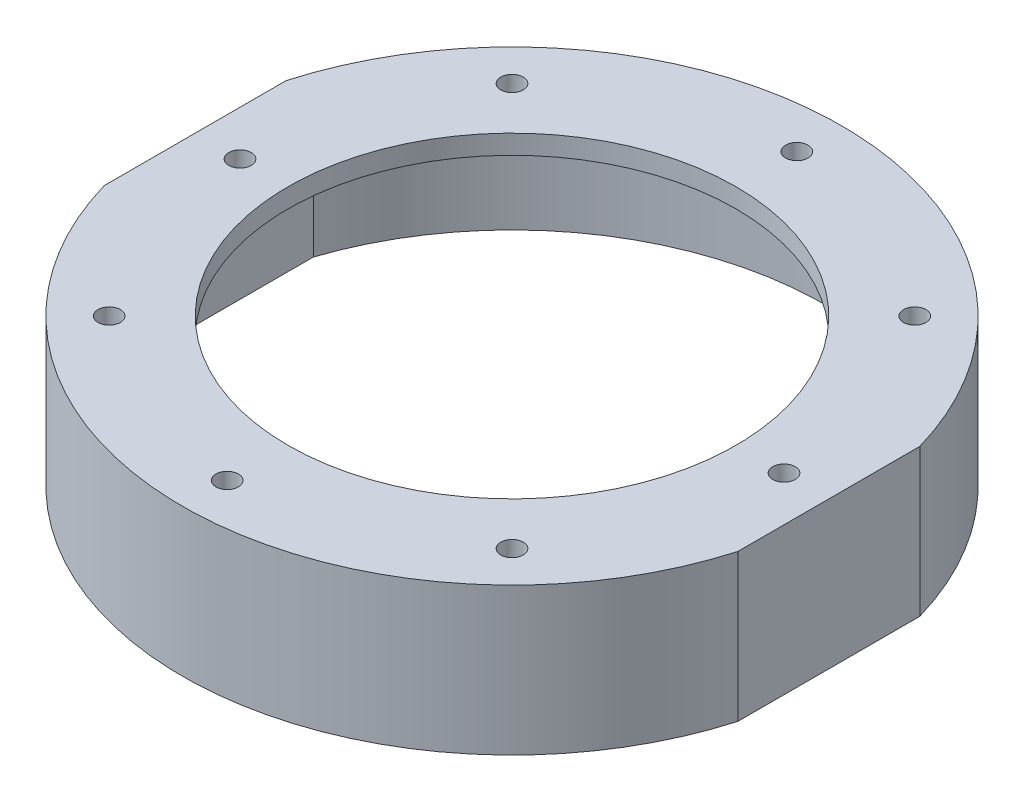
ISO-10303-21;
HEADER;
FILE_DESCRIPTION(('STEP AP214'),'2;1');
FILE_NAME('part.step','',(''),(''),'','','');
FILE_SCHEMA(('AUTOMOTIVE_DESIGN { 1 0 10303 214 1 1 1 1 }'));
ENDSEC;
DATA;
#1=APPLICATION_CONTEXT('core data for automotive mechanical design processes');
#2=APPLICATION_PROTOCOL_DEFINITION('international standard','automotive_design',2000,#1);
#3=PRODUCT_CONTEXT('',#1,'mechanical');
#4=PRODUCT('Part','Part','',(#3));
#5=PRODUCT_RELATED_PRODUCT_CATEGORY('part','',(#4));
#6=PRODUCT_DEFINITION_FORMATION('','',#4);
#7=PRODUCT_DEFINITION_CONTEXT('part definition',#1,'design');
#8=PRODUCT_DEFINITION('design','',#6,#7);
#9=PRODUCT_DEFINITION_SHAPE('','',#8);
#10=(LENGTH_UNIT() NAMED_UNIT(*) SI_UNIT(.MILLI.,.METRE.));
#11=(NAMED_UNIT(*) PLANE_ANGLE_UNIT() SI_UNIT($,.RADIAN.));
#12=(NAMED_UNIT(*) SI_UNIT($,.STERADIAN.) SOLID_ANGLE_UNIT());
#13=UNCERTAINTY_MEASURE_WITH_UNIT(LENGTH_MEASURE(1.E-05),#10,'distance_accuracy_value','');
#14=(GEOMETRIC_REPRESENTATION_CONTEXT(3) GLOBAL_UNCERTAINTY_ASSIGNED_CONTEXT((#13)) GLOBAL_UNIT_ASSIGNED_CONTEXT((#10,
#11,#12)) REPRESENTATION_CONTEXT('',''));
#15=CARTESIAN_POINT('',(0.,0.,0.));
#16=DIRECTION('',(0.,0.,1.));
#17=DIRECTION('',(1.,0.,0.));
#18=AXIS2_PLACEMENT_3D('',#15,#16,#17);
#19=CARTESIAN_POINT('',(0.,0.,0.));
#20=DIRECTION('',(0.,1.,0.));
#21=DIRECTION('',(0.,0.,1.));
#22=AXIS2_PLACEMENT_3D('',#19,#20,#21);
#23=PLANE('',#22);
#24=CARTESIAN_POINT('',(0.,0.,0.));
#25=DIRECTION('',(0.,1.,0.));
#26=DIRECTION('',(0.,0.,1.));
#27=AXIS2_PLACEMENT_3D('',#24,#25,#26);
#28=CIRCLE('',#27,49.);
#29=CARTESIAN_POINT('',(46.5,0.,-15.4515371403624));
#30=VERTEX_POINT('',#29);
#31=CARTESIAN_POINT('',(-46.5,0.,-15.4515371403625));
#32=VERTEX_POINT('',#31);
#33=EDGE_CURVE('E176',#30,#32,#28,.T.);
#34=ORIENTED_EDGE('',*,*,#33,.T.);
#35=DIRECTION('',(0.,0.,-1.));
#36=VECTOR('',#35,1.);
#37=CARTESIAN_POINT('',(-46.5,0.,0.));
#38=LINE('',#37,#36);
#39=CARTESIAN_POINT('',(-46.5,0.,15.4515371403625));
#40=VERTEX_POINT('',#39);
#41=EDGE_CURVE('E163',#40,#32,#38,.T.);
#42=ORIENTED_EDGE('',*,*,#41,.F.);
#43=CARTESIAN_POINT('',(0.,0.,0.));
#44=DIRECTION('',(0.,1.,0.));
#45=DIRECTION('',(0.,0.,1.));
#46=AXIS2_PLACEMENT_3D('',#43,#44,#45);
#47=CIRCLE('',#46,49.);
#48=CARTESIAN_POINT('',(46.5,0.,15.4515371403624));
#49=VERTEX_POINT('',#48);
#50=EDGE_CURVE('E184',#40,#49,#47,.T.);
#51=ORIENTED_EDGE('',*,*,#50,.T.);
#52=DIRECTION('',(0.,0.,-1.));
#53=VECTOR('',#52,1.);
#54=CARTESIAN_POINT('',(46.5,0.,0.));
#55=LINE('',#54,#53);
#56=EDGE_CURVE('E180',#49,#30,#55,.T.);
#57=ORIENTED_EDGE('',*,*,#56,.T.);
#58=EDGE_LOOP('',(#34,#42,#51,#57));
#59=FACE_BOUND('',#58,.T.);
#60=CARTESIAN_POINT('',(0.,0.,0.));
#61=DIRECTION('',(0.,1.,0.));
#62=DIRECTION('',(0.,0.,1.));
#63=AXIS2_PLACEMENT_3D('',#60,#61,#62);
#64=CIRCLE('',#63,51.5);
#65=CARTESIAN_POINT('',(49.5,0.,-14.2126704035518));
#66=VERTEX_POINT('',#65);
#67=CARTESIAN_POINT('',(-49.5,0.,-14.2126704035519));
#68=VERTEX_POINT('',#67);
#69=EDGE_CURVE('E127',#66,#68,#64,.T.);
#70=ORIENTED_EDGE('',*,*,#69,.F.);
#71=DIRECTION('',(0.,0.,-1.));
#72=VECTOR('',#71,1.);
#73=CARTESIAN_POINT('',(49.5,0.,0.));
#74=LINE('',#73,#72);
#75=CARTESIAN_POINT('',(49.5,0.,14.2126704035518));
#76=VERTEX_POINT('',#75);
#77=EDGE_CURVE('E129',#76,#66,#74,.T.);
#78=ORIENTED_EDGE('',*,*,#77,.F.);
#79=CARTESIAN_POINT('',(-49.5,0.,14.2126704035519));
#80=VERTEX_POINT('',#79);
#81=EDGE_CURVE('E134',#80,#76,#64,.T.);
#82=ORIENTED_EDGE('',*,*,#81,.F.);
#83=DIRECTION('',(0.,0.,-1.));
#84=VECTOR('',#83,1.);
#85=CARTESIAN_POINT('',(-49.5,0.,0.));
#86=LINE('',#85,#84);
#87=EDGE_CURVE('E119',#80,#68,#86,.T.);
#88=ORIENTED_EDGE('',*,*,#87,.T.);
#89=EDGE_LOOP('',(#70,#78,#82,#88));
#90=FACE_BOUND('',#89,.T.);
#91=ADVANCED_FACE('F47',(#59,#90),#23,.F.);
#92=CARTESIAN_POINT('',(0.,0.,0.));
#93=DIRECTION('',(0.,1.,0.));
#94=DIRECTION('',(0.,0.,1.));
#95=AXIS2_PLACEMENT_3D('',#92,#93,#94);
#96=CYLINDRICAL_SURFACE('',#95,51.5);
#97=DIRECTION('',(0.,1.,0.));
#98=VECTOR('',#97,1.);
#99=CARTESIAN_POINT('',(49.5,0.,14.2126704035518));
#100=LINE('',#99,#98);
#101=CARTESIAN_POINT('',(49.5,23.,14.2126704035518));
#102=VERTEX_POINT('',#101);
#103=EDGE_CURVE('E150',#102,#76,#100,.F.);
#104=ORIENTED_EDGE('',*,*,#103,.F.);
#105=CARTESIAN_POINT('',(0.,23.,0.));
#106=DIRECTION('',(0.,1.,0.));
#107=DIRECTION('',(0.,0.,1.));
#108=AXIS2_PLACEMENT_3D('',#105,#106,#107);
#109=CIRCLE('',#108,51.5);
#110=CARTESIAN_POINT('',(-49.5,23.,14.2126704035519));
#111=VERTEX_POINT('',#110);
#112=EDGE_CURVE('E135',#111,#102,#109,.T.);
#113=ORIENTED_EDGE('',*,*,#112,.F.);
#114=DIRECTION('',(0.,-1.,0.));
#115=VECTOR('',#114,1.);
#116=CARTESIAN_POINT('',(-49.5,23.,14.2126704035519));
#117=LINE('',#116,#115);
#118=EDGE_CURVE('E63',#111,#80,#117,.T.);
#119=ORIENTED_EDGE('',*,*,#118,.T.);
#120=ORIENTED_EDGE('',*,*,#81,.T.);
#121=EDGE_LOOP('',(#104,#113,#119,#120));
#122=FACE_BOUND('',#121,.T.);
#123=ADVANCED_FACE('F233',(#122),#96,.T.);
#124=DIRECTION('',(0.,1.,0.));
#125=VECTOR('',#124,1.);
#126=CARTESIAN_POINT('',(49.5,0.,-14.2126704035518));
#127=LINE('',#126,#125);
#128=CARTESIAN_POINT('',(49.5,23.,-14.2126704035518));
#129=VERTEX_POINT('',#128);
#130=EDGE_CURVE('E70',#66,#129,#127,.T.);
#131=ORIENTED_EDGE('',*,*,#130,.F.);
#132=ORIENTED_EDGE('',*,*,#69,.T.);
#133=DIRECTION('',(0.,-1.,0.));
#134=VECTOR('',#133,1.);
#135=CARTESIAN_POINT('',(-49.5,23.,-14.2126704035519));
#136=LINE('',#135,#134);
#137=CARTESIAN_POINT('',(-49.5,23.,-14.2126704035519));
#138=VERTEX_POINT('',#137);
#139=EDGE_CURVE('E112',#138,#68,#136,.T.);
#140=ORIENTED_EDGE('',*,*,#139,.F.);
#141=EDGE_CURVE('E125',#129,#138,#109,.T.);
#142=ORIENTED_EDGE('',*,*,#141,.F.);
#143=EDGE_LOOP('',(#131,#132,#140,#142));
#144=FACE_BOUND('',#143,.T.);
#145=ADVANCED_FACE('F124',(#144),#96,.T.);
#146=CARTESIAN_POINT('',(0.,23.,0.));
#147=DIRECTION('',(0.,1.,0.));
#148=DIRECTION('',(0.,0.,1.));
#149=AXIS2_PLACEMENT_3D('',#146,#147,#148);
#150=PLANE('',#149);
#151=CARTESIAN_POINT('',(0.,23.,-44.5));
#152=DIRECTION('',(0.,1.,0.));
#153=DIRECTION('',(0.,0.,1.));
#154=AXIS2_PLACEMENT_3D('',#151,#152,#153);
#155=CIRCLE('',#154,1.75);
#156=CARTESIAN_POINT('',(0.,23.,-42.75));
#157=VERTEX_POINT('',#156);
#158=EDGE_CURVE('E289',#157,#157,#155,.T.);
#159=ORIENTED_EDGE('',*,*,#158,.F.);
#160=EDGE_LOOP('',(#159));
#161=FACE_BOUND('',#160,.T.);
#162=CARTESIAN_POINT('',(-31.466251762801,23.,-31.4662517628018));
#163=DIRECTION('',(0.,1.,0.));
#164=DIRECTION('',(0.,0.,1.));
#165=AXIS2_PLACEMENT_3D('',#162,#163,#164);
#166=CIRCLE('',#165,1.74999999999999);
#167=CARTESIAN_POINT('',(-31.466251762801,23.,-29.7162517628018));
#168=VERTEX_POINT('',#167);
#169=EDGE_CURVE('E300',#168,#168,#166,.T.);
#170=ORIENTED_EDGE('',*,*,#169,.F.);
#171=EDGE_LOOP('',(#170));
#172=FACE_BOUND('',#171,.T.);
#173=CARTESIAN_POINT('',(-31.4662517628016,23.,31.4662517628011));
#174=DIRECTION('',(0.,1.,0.));
#175=DIRECTION('',(0.,0.,1.));
#176=AXIS2_PLACEMENT_3D('',#173,#174,#175);
#177=CIRCLE('',#176,1.75);
#178=CARTESIAN_POINT('',(-31.4662517628016,23.,33.2162517628011));
#179=VERTEX_POINT('',#178);
#180=EDGE_CURVE('E328',#179,#179,#177,.T.);
#181=ORIENTED_EDGE('',*,*,#180,.F.);
#182=EDGE_LOOP('',(#181));
#183=FACE_BOUND('',#182,.T.);
#184=CARTESIAN_POINT('',(-3.10741839157039E-13,23.,44.5));
#185=DIRECTION('',(0.,1.,0.));
#186=DIRECTION('',(0.,0.,1.));
#187=AXIS2_PLACEMENT_3D('',#184,#185,#186);
#188=CIRCLE('',#187,1.75);
#189=CARTESIAN_POINT('',(-3.10741839157039E-13,23.,46.25));
#190=VERTEX_POINT('',#189);
#191=EDGE_CURVE('E320',#190,#190,#188,.T.);
#192=ORIENTED_EDGE('',*,*,#191,.F.);
#193=EDGE_LOOP('',(#192));
#194=FACE_BOUND('',#193,.T.);
#195=CARTESIAN_POINT('',(31.4662517628012,23.,31.4662517628015));
#196=DIRECTION('',(0.,1.,0.));
#197=DIRECTION('',(0.,0.,1.));
#198=AXIS2_PLACEMENT_3D('',#195,#196,#197);
#199=CIRCLE('',#198,1.75);
#200=CARTESIAN_POINT('',(31.4662517628012,23.,33.2162517628015));
#201=VERTEX_POINT('',#200);
#202=EDGE_CURVE('E312',#201,#201,#199,.T.);
#203=ORIENTED_EDGE('',*,*,#202,.F.);
#204=EDGE_LOOP('',(#203));
#205=FACE_BOUND('',#204,.T.);
#206=CARTESIAN_POINT('',(31.4662517628014,23.,-31.4662517628013));
#207=DIRECTION('',(0.,1.,0.));
#208=DIRECTION('',(0.,0.,1.));
#209=AXIS2_PLACEMENT_3D('',#206,#207,#208);
#210=CIRCLE('',#209,1.75);
#211=CARTESIAN_POINT('',(31.4662517628014,23.,-29.7162517628013));
#212=VERTEX_POINT('',#211);
#213=EDGE_CURVE('E291',#212,#212,#210,.T.);
#214=ORIENTED_EDGE('',*,*,#213,.F.);
#215=EDGE_LOOP('',(#214));
#216=FACE_BOUND('',#215,.T.);
#217=DIRECTION('',(0.,0.,1.));
#218=VECTOR('',#217,1.);
#219=CARTESIAN_POINT('',(49.5,23.,0.));
#220=LINE('',#219,#218);
#221=EDGE_CURVE('E11',#129,#102,#220,.T.);
#222=ORIENTED_EDGE('',*,*,#221,.F.);
#223=ORIENTED_EDGE('',*,*,#141,.T.);
#224=DIRECTION('',(0.,0.,-1.));
#225=VECTOR('',#224,1.);
#226=CARTESIAN_POINT('',(-49.5,23.,0.));
#227=LINE('',#226,#225);
#228=EDGE_CURVE('E109',#111,#138,#227,.T.);
#229=ORIENTED_EDGE('',*,*,#228,.F.);
#230=ORIENTED_EDGE('',*,*,#112,.T.);
#231=EDGE_LOOP('',(#222,#223,#229,#230));
#232=FACE_BOUND('',#231,.T.);
#233=CARTESIAN_POINT('',(-42.5,23.,-4.451638707025E-13));
#234=DIRECTION('',(0.,1.,0.));
#235=DIRECTION('',(0.,0.,1.));
#236=AXIS2_PLACEMENT_3D('',#233,#234,#235);
#237=CIRCLE('',#236,1.75);
#238=CARTESIAN_POINT('',(-42.5,23.,1.74999999999955));
#239=VERTEX_POINT('',#238);
#240=EDGE_CURVE('E157',#239,#239,#237,.T.);
#241=ORIENTED_EDGE('',*,*,#240,.F.);
#242=EDGE_LOOP('',(#241));
#243=FACE_BOUND('',#242,.T.);
#244=CARTESIAN_POINT('',(42.5,23.,1.48387956900833E-13));
#245=DIRECTION('',(0.,1.,0.));
#246=DIRECTION('',(0.,0.,1.));
#247=AXIS2_PLACEMENT_3D('',#244,#245,#246);
#248=CIRCLE('',#247,1.75);
#249=CARTESIAN_POINT('',(42.5,23.,1.75000000000015));
#250=VERTEX_POINT('',#249);
#251=EDGE_CURVE('E347',#250,#250,#248,.T.);
#252=ORIENTED_EDGE('',*,*,#251,.F.);
#253=EDGE_LOOP('',(#252));
#254=FACE_BOUND('',#253,.T.);
#255=CARTESIAN_POINT('',(0.,23.,0.));
#256=DIRECTION('',(0.,1.,0.));
#257=DIRECTION('',(0.,0.,1.));
#258=AXIS2_PLACEMENT_3D('',#255,#256,#257);
#259=CIRCLE('',#258,35.);
#260=CARTESIAN_POINT('',(0.,23.,35.));
#261=VERTEX_POINT('',#260);
#262=EDGE_CURVE('E141',#261,#261,#259,.T.);
#263=ORIENTED_EDGE('',*,*,#262,.F.);
#264=EDGE_LOOP('',(#263));
#265=FACE_BOUND('',#264,.T.);
#266=ADVANCED_FACE('F131',(#161,#172,#183,#194,#205,#216,#232,#243,#254,#265),#150,.T.);
#267=CARTESIAN_POINT('',(0.,20.,0.));
#268=DIRECTION('',(0.,-1.,0.));
#269=DIRECTION('',(0.,0.,-1.));
#270=AXIS2_PLACEMENT_3D('',#267,#268,#269);
#271=CYLINDRICAL_SURFACE('',#270,49.);
#272=ORIENTED_EDGE('',*,*,#33,.F.);
#273=DIRECTION('',(0.,-1.,0.));
#274=VECTOR('',#273,1.);
#275=CARTESIAN_POINT('',(46.5,20.,-15.4515371403624));
#276=LINE('',#275,#274);
#277=CARTESIAN_POINT('',(46.5,20.,-15.4515371403624));
#278=VERTEX_POINT('',#277);
#279=EDGE_CURVE('E56',#278,#30,#276,.T.);
#280=ORIENTED_EDGE('',*,*,#279,.F.);
#281=CARTESIAN_POINT('',(0.,20.,0.));
#282=DIRECTION('',(0.,1.,0.));
#283=DIRECTION('',(0.,0.,1.));
#284=AXIS2_PLACEMENT_3D('',#281,#282,#283);
#285=CIRCLE('',#284,49.);
#286=CARTESIAN_POINT('',(-46.5,20.,-15.4515371403625));
#287=VERTEX_POINT('',#286);
#288=EDGE_CURVE('E159',#278,#287,#285,.T.);
#289=ORIENTED_EDGE('',*,*,#288,.T.);
#290=DIRECTION('',(0.,-1.,0.));
#291=VECTOR('',#290,1.);
#292=CARTESIAN_POINT('',(-46.5,20.,-15.4515371403625));
#293=LINE('',#292,#291);
#294=EDGE_CURVE('E175',#287,#32,#293,.T.);
#295=ORIENTED_EDGE('',*,*,#294,.T.);
#296=EDGE_LOOP('',(#272,#280,#289,#295));
#297=FACE_BOUND('',#296,.T.);
#298=ADVANCED_FACE('F49',(#297),#271,.F.);
#299=CARTESIAN_POINT('',(46.5,20.,0.));
#300=DIRECTION('',(-1.,0.,0.));
#301=DIRECTION('',(0.,0.,1.));
#302=AXIS2_PLACEMENT_3D('',#299,#300,#301);
#303=PLANE('',#302);
#304=ORIENTED_EDGE('',*,*,#56,.F.);
#305=DIRECTION('',(0.,-1.,0.));
#306=VECTOR('',#305,1.);
#307=CARTESIAN_POINT('',(46.5,20.,15.4515371403624));
#308=LINE('',#307,#306);
#309=CARTESIAN_POINT('',(46.5,20.,15.4515371403624));
#310=VERTEX_POINT('',#309);
#311=EDGE_CURVE('E196',#310,#49,#308,.T.);
#312=ORIENTED_EDGE('',*,*,#311,.F.);
#313=DIRECTION('',(0.,0.,-1.));
#314=VECTOR('',#313,1.);
#315=CARTESIAN_POINT('',(46.5,20.,0.));
#316=LINE('',#315,#314);
#317=EDGE_CURVE('E162',#310,#278,#316,.T.);
#318=ORIENTED_EDGE('',*,*,#317,.T.);
#319=ORIENTED_EDGE('',*,*,#279,.T.);
#320=EDGE_LOOP('',(#304,#312,#318,#319));
#321=FACE_BOUND('',#320,.T.);
#322=ADVANCED_FACE('F202',(#321),#303,.T.);
#323=CARTESIAN_POINT('',(0.,20.,0.));
#324=DIRECTION('',(0.,-1.,0.));
#325=DIRECTION('',(0.,0.,-1.));
#326=AXIS2_PLACEMENT_3D('',#323,#324,#325);
#327=CYLINDRICAL_SURFACE('',#326,49.);
#328=ORIENTED_EDGE('',*,*,#50,.F.);
#329=DIRECTION('',(0.,-1.,0.));
#330=VECTOR('',#329,1.);
#331=CARTESIAN_POINT('',(-46.5,20.,15.4515371403625));
#332=LINE('',#331,#330);
#333=CARTESIAN_POINT('',(-46.5,20.,15.4515371403625));
#334=VERTEX_POINT('',#333);
#335=EDGE_CURVE('E193',#334,#40,#332,.T.);
#336=ORIENTED_EDGE('',*,*,#335,.F.);
#337=CARTESIAN_POINT('',(0.,20.,0.));
#338=DIRECTION('',(0.,1.,0.));
#339=DIRECTION('',(0.,0.,1.));
#340=AXIS2_PLACEMENT_3D('',#337,#338,#339);
#341=CIRCLE('',#340,49.);
#342=EDGE_CURVE('E167',#334,#310,#341,.T.);
#343=ORIENTED_EDGE('',*,*,#342,.T.);
#344=ORIENTED_EDGE('',*,*,#311,.T.);
#345=EDGE_LOOP('',(#328,#336,#343,#344));
#346=FACE_BOUND('',#345,.T.);
#347=ADVANCED_FACE('F212',(#346),#327,.F.);
#348=CARTESIAN_POINT('',(-46.5,20.,0.));
#349=DIRECTION('',(-1.,0.,0.));
#350=DIRECTION('',(0.,0.,1.));
#351=AXIS2_PLACEMENT_3D('',#348,#349,#350);
#352=PLANE('',#351);
#353=ORIENTED_EDGE('',*,*,#41,.T.);
#354=ORIENTED_EDGE('',*,*,#294,.F.);
#355=DIRECTION('',(0.,0.,-1.));
#356=VECTOR('',#355,1.);
#357=CARTESIAN_POINT('',(-46.5,20.,0.));
#358=LINE('',#357,#356);
#359=EDGE_CURVE('E171',#334,#287,#358,.T.);
#360=ORIENTED_EDGE('',*,*,#359,.F.);
#361=ORIENTED_EDGE('',*,*,#335,.T.);
#362=EDGE_LOOP('',(#353,#354,#360,#361));
#363=FACE_BOUND('',#362,.T.);
#364=ADVANCED_FACE('F219',(#363),#352,.F.);
#365=CARTESIAN_POINT('',(0.,23.,0.));
#366=DIRECTION('',(0.,-1.,0.));
#367=DIRECTION('',(0.,0.,-1.));
#368=AXIS2_PLACEMENT_3D('',#365,#366,#367);
#369=CYLINDRICAL_SURFACE('',#368,35.);
#370=ORIENTED_EDGE('',*,*,#262,.T.);
#371=EDGE_LOOP('',(#370));
#372=FACE_BOUND('',#371,.T.);
#373=CARTESIAN_POINT('',(0.,20.,0.));
#374=DIRECTION('',(0.,1.,0.));
#375=DIRECTION('',(0.,0.,1.));
#376=AXIS2_PLACEMENT_3D('',#373,#374,#375);
#377=CIRCLE('',#376,35.);
#378=CARTESIAN_POINT('',(0.,20.,35.));
#379=VERTEX_POINT('',#378);
#380=EDGE_CURVE('E154',#379,#379,#377,.T.);
#381=ORIENTED_EDGE('',*,*,#380,.F.);
#382=EDGE_LOOP('',(#381));
#383=FACE_BOUND('',#382,.T.);
#384=ADVANCED_FACE('F221',(#372,#383),#369,.F.);
#385=CARTESIAN_POINT('',(42.5,23.,1.48387956900833E-13));
#386=DIRECTION('',(0.,-1.,0.));
#387=DIRECTION('',(0.,0.,-1.));
#388=AXIS2_PLACEMENT_3D('',#385,#386,#387);
#389=CYLINDRICAL_SURFACE('',#388,1.75);
#390=ORIENTED_EDGE('',*,*,#251,.T.);
#391=EDGE_LOOP('',(#390));
#392=FACE_BOUND('',#391,.T.);
#393=CARTESIAN_POINT('',(42.5,20.,1.48387956900833E-13));
#394=DIRECTION('',(0.,1.,0.));
#395=DIRECTION('',(0.,0.,1.));
#396=AXIS2_PLACEMENT_3D('',#393,#394,#395);
#397=CIRCLE('',#396,1.75);
#398=CARTESIAN_POINT('',(42.5,20.,1.75000000000015));
#399=VERTEX_POINT('',#398);
#400=EDGE_CURVE('E149',#399,#399,#397,.T.);
#401=ORIENTED_EDGE('',*,*,#400,.F.);
#402=EDGE_LOOP('',(#401));
#403=FACE_BOUND('',#402,.T.);
#404=ADVANCED_FACE('F227',(#392,#403),#389,.F.);
#405=CARTESIAN_POINT('',(-42.5,23.,-4.451638707025E-13));
#406=DIRECTION('',(0.,-1.,0.));
#407=DIRECTION('',(0.,0.,-1.));
#408=AXIS2_PLACEMENT_3D('',#405,#406,#407);
#409=CYLINDRICAL_SURFACE('',#408,1.75);
#410=ORIENTED_EDGE('',*,*,#240,.T.);
#411=EDGE_LOOP('',(#410));
#412=FACE_BOUND('',#411,.T.);
#413=CARTESIAN_POINT('',(-42.5,20.,-4.451638707025E-13));
#414=DIRECTION('',(0.,1.,0.));
#415=DIRECTION('',(0.,0.,1.));
#416=AXIS2_PLACEMENT_3D('',#413,#414,#415);
#417=CIRCLE('',#416,1.75);
#418=CARTESIAN_POINT('',(-42.5,20.,1.74999999999955));
#419=VERTEX_POINT('',#418);
#420=EDGE_CURVE('E145',#419,#419,#417,.T.);
#421=ORIENTED_EDGE('',*,*,#420,.F.);
#422=EDGE_LOOP('',(#421));
#423=FACE_BOUND('',#422,.T.);
#424=ADVANCED_FACE('F241',(#412,#423),#409,.F.);
#425=CARTESIAN_POINT('',(0.,20.,0.));
#426=DIRECTION('',(0.,1.,0.));
#427=DIRECTION('',(0.,0.,1.));
#428=AXIS2_PLACEMENT_3D('',#425,#426,#427);
#429=PLANE('',#428);
#430=CARTESIAN_POINT('',(0.,20.,-44.5));
#431=DIRECTION('',(0.,1.,0.));
#432=DIRECTION('',(0.,0.,1.));
#433=AXIS2_PLACEMENT_3D('',#430,#431,#432);
#434=CIRCLE('',#433,1.75);
#435=CARTESIAN_POINT('',(0.,20.,-42.75));
#436=VERTEX_POINT('',#435);
#437=EDGE_CURVE('E286',#436,#436,#434,.T.);
#438=ORIENTED_EDGE('',*,*,#437,.T.);
#439=EDGE_LOOP('',(#438));
#440=FACE_BOUND('',#439,.T.);
#441=CARTESIAN_POINT('',(-31.466251762801,20.,-31.4662517628018));
#442=DIRECTION('',(0.,1.,0.));
#443=DIRECTION('',(0.,0.,1.));
#444=AXIS2_PLACEMENT_3D('',#441,#442,#443);
#445=CIRCLE('',#444,1.74999999999999);
#446=CARTESIAN_POINT('',(-31.466251762801,20.,-29.7162517628018));
#447=VERTEX_POINT('',#446);
#448=EDGE_CURVE('E305',#447,#447,#445,.T.);
#449=ORIENTED_EDGE('',*,*,#448,.T.);
#450=EDGE_LOOP('',(#449));
#451=FACE_BOUND('',#450,.T.);
#452=CARTESIAN_POINT('',(-31.4662517628016,20.,31.4662517628011));
#453=DIRECTION('',(0.,1.,0.));
#454=DIRECTION('',(0.,0.,1.));
#455=AXIS2_PLACEMENT_3D('',#452,#453,#454);
#456=CIRCLE('',#455,1.75);
#457=CARTESIAN_POINT('',(-31.4662517628016,20.,33.2162517628011));
#458=VERTEX_POINT('',#457);
#459=EDGE_CURVE('E304',#458,#458,#456,.T.);
#460=ORIENTED_EDGE('',*,*,#459,.T.);
#461=EDGE_LOOP('',(#460));
#462=FACE_BOUND('',#461,.T.);
#463=CARTESIAN_POINT('',(-3.10741839157039E-13,20.,44.5));
#464=DIRECTION('',(0.,1.,0.));
#465=DIRECTION('',(0.,0.,1.));
#466=AXIS2_PLACEMENT_3D('',#463,#464,#465);
#467=CIRCLE('',#466,1.75);
#468=CARTESIAN_POINT('',(-3.10741839157039E-13,20.,46.25));
#469=VERTEX_POINT('',#468);
#470=EDGE_CURVE('E324',#469,#469,#467,.T.);
#471=ORIENTED_EDGE('',*,*,#470,.T.);
#472=EDGE_LOOP('',(#471));
#473=FACE_BOUND('',#472,.T.);
#474=CARTESIAN_POINT('',(31.4662517628012,20.,31.4662517628015));
#475=DIRECTION('',(0.,1.,0.));
#476=DIRECTION('',(0.,0.,1.));
#477=AXIS2_PLACEMENT_3D('',#474,#475,#476);
#478=CIRCLE('',#477,1.75);
#479=CARTESIAN_POINT('',(31.4662517628012,20.,33.2162517628015));
#480=VERTEX_POINT('',#479);
#481=EDGE_CURVE('E316',#480,#480,#478,.T.);
#482=ORIENTED_EDGE('',*,*,#481,.T.);
#483=EDGE_LOOP('',(#482));
#484=FACE_BOUND('',#483,.T.);
#485=CARTESIAN_POINT('',(31.4662517628014,20.,-31.4662517628013));
#486=DIRECTION('',(0.,1.,0.));
#487=DIRECTION('',(0.,0.,1.));
#488=AXIS2_PLACEMENT_3D('',#485,#486,#487);
#489=CIRCLE('',#488,1.75);
#490=CARTESIAN_POINT('',(31.4662517628014,20.,-29.7162517628013));
#491=VERTEX_POINT('',#490);
#492=EDGE_CURVE('E297',#491,#491,#489,.T.);
#493=ORIENTED_EDGE('',*,*,#492,.T.);
#494=EDGE_LOOP('',(#493));
#495=FACE_BOUND('',#494,.T.);
#496=ORIENTED_EDGE('',*,*,#288,.F.);
#497=ORIENTED_EDGE('',*,*,#317,.F.);
#498=ORIENTED_EDGE('',*,*,#342,.F.);
#499=ORIENTED_EDGE('',*,*,#359,.T.);
#500=EDGE_LOOP('',(#496,#497,#498,#499));
#501=FACE_BOUND('',#500,.T.);
#502=ORIENTED_EDGE('',*,*,#420,.T.);
#503=EDGE_LOOP('',(#502));
#504=FACE_BOUND('',#503,.T.);
#505=ORIENTED_EDGE('',*,*,#400,.T.);
#506=EDGE_LOOP('',(#505));
#507=FACE_BOUND('',#506,.T.);
#508=ORIENTED_EDGE('',*,*,#380,.T.);
#509=EDGE_LOOP('',(#508));
#510=FACE_BOUND('',#509,.T.);
#511=ADVANCED_FACE('F216',(#440,#451,#462,#473,#484,#495,#501,#504,#507,#510),#429,.F.);
#512=CARTESIAN_POINT('',(-49.5,23.,0.));
#513=DIRECTION('',(-1.,0.,0.));
#514=DIRECTION('',(0.,0.,1.));
#515=AXIS2_PLACEMENT_3D('',#512,#513,#514);
#516=PLANE('',#515);
#517=ORIENTED_EDGE('',*,*,#87,.F.);
#518=ORIENTED_EDGE('',*,*,#118,.F.);
#519=ORIENTED_EDGE('',*,*,#228,.T.);
#520=ORIENTED_EDGE('',*,*,#139,.T.);
#521=EDGE_LOOP('',(#517,#518,#519,#520));
#522=FACE_BOUND('',#521,.T.);
#523=ADVANCED_FACE('F111',(#522),#516,.T.);
#524=CARTESIAN_POINT('',(49.5,23.,0.));
#525=DIRECTION('',(-1.,0.,0.));
#526=DIRECTION('',(0.,0.,1.));
#527=AXIS2_PLACEMENT_3D('',#524,#525,#526);
#528=PLANE('',#527);
#529=ORIENTED_EDGE('',*,*,#103,.T.);
#530=ORIENTED_EDGE('',*,*,#77,.T.);
#531=ORIENTED_EDGE('',*,*,#130,.T.);
#532=ORIENTED_EDGE('',*,*,#221,.T.);
#533=EDGE_LOOP('',(#529,#530,#531,#532));
#534=FACE_BOUND('',#533,.T.);
#535=ADVANCED_FACE('F255',(#534),#528,.F.);
#536=CARTESIAN_POINT('',(31.4662517628014,20.,-31.4662517628013));
#537=DIRECTION('',(0.,1.,0.));
#538=DIRECTION('',(0.,0.,1.));
#539=AXIS2_PLACEMENT_3D('',#536,#537,#538);
#540=CYLINDRICAL_SURFACE('',#539,1.75);
#541=ORIENTED_EDGE('',*,*,#492,.F.);
#542=EDGE_LOOP('',(#541));
#543=FACE_BOUND('',#542,.T.);
#544=ORIENTED_EDGE('',*,*,#213,.T.);
#545=EDGE_LOOP('',(#544));
#546=FACE_BOUND('',#545,.T.);
#547=ADVANCED_FACE('F258',(#543,#546),#540,.F.);
#548=CARTESIAN_POINT('',(31.4662517628012,20.,31.4662517628015));
#549=DIRECTION('',(0.,1.,0.));
#550=DIRECTION('',(0.,0.,1.));
#551=AXIS2_PLACEMENT_3D('',#548,#549,#550);
#552=CYLINDRICAL_SURFACE('',#551,1.75);
#553=ORIENTED_EDGE('',*,*,#481,.F.);
#554=EDGE_LOOP('',(#553));
#555=FACE_BOUND('',#554,.T.);
#556=ORIENTED_EDGE('',*,*,#202,.T.);
#557=EDGE_LOOP('',(#556));
#558=FACE_BOUND('',#557,.T.);
#559=ADVANCED_FACE('F267',(#555,#558),#552,.F.);
#560=CARTESIAN_POINT('',(-3.10741839157039E-13,20.,44.5));
#561=DIRECTION('',(0.,1.,0.));
#562=DIRECTION('',(0.,0.,1.));
#563=AXIS2_PLACEMENT_3D('',#560,#561,#562);
#564=CYLINDRICAL_SURFACE('',#563,1.75);
#565=ORIENTED_EDGE('',*,*,#470,.F.);
#566=EDGE_LOOP('',(#565));
#567=FACE_BOUND('',#566,.T.);
#568=ORIENTED_EDGE('',*,*,#191,.T.);
#569=EDGE_LOOP('',(#568));
#570=FACE_BOUND('',#569,.T.);
#571=ADVANCED_FACE('F263',(#567,#570),#564,.F.);
#572=CARTESIAN_POINT('',(-31.4662517628016,20.,31.4662517628011));
#573=DIRECTION('',(0.,1.,0.));
#574=DIRECTION('',(0.,0.,1.));
#575=AXIS2_PLACEMENT_3D('',#572,#573,#574);
#576=CYLINDRICAL_SURFACE('',#575,1.75);
#577=ORIENTED_EDGE('',*,*,#459,.F.);
#578=EDGE_LOOP('',(#577));
#579=FACE_BOUND('',#578,.T.);
#580=ORIENTED_EDGE('',*,*,#180,.T.);
#581=EDGE_LOOP('',(#580));
#582=FACE_BOUND('',#581,.T.);
#583=ADVANCED_FACE('F259',(#579,#582),#576,.F.);
#584=CARTESIAN_POINT('',(-31.466251762801,20.,-31.4662517628018));
#585=DIRECTION('',(0.,1.,0.));
#586=DIRECTION('',(0.,0.,1.));
#587=AXIS2_PLACEMENT_3D('',#584,#585,#586);
#588=CYLINDRICAL_SURFACE('',#587,1.74999999999999);
#589=ORIENTED_EDGE('',*,*,#448,.F.);
#590=EDGE_LOOP('',(#589));
#591=FACE_BOUND('',#590,.T.);
#592=ORIENTED_EDGE('',*,*,#169,.T.);
#593=EDGE_LOOP('',(#592));
#594=FACE_BOUND('',#593,.T.);
#595=ADVANCED_FACE('F262',(#591,#594),#588,.F.);
#596=CARTESIAN_POINT('',(0.,20.,-44.5));
#597=DIRECTION('',(0.,1.,0.));
#598=DIRECTION('',(0.,0.,1.));
#599=AXIS2_PLACEMENT_3D('',#596,#597,#598);
#600=CYLINDRICAL_SURFACE('',#599,1.75);
#601=ORIENTED_EDGE('',*,*,#437,.F.);
#602=EDGE_LOOP('',(#601));
#603=FACE_BOUND('',#602,.T.);
#604=ORIENTED_EDGE('',*,*,#158,.T.);
#605=EDGE_LOOP('',(#604));
#606=FACE_BOUND('',#605,.T.);
#607=ADVANCED_FACE('F277',(#603,#606),#600,.F.);
#608=CLOSED_SHELL('',(#91,#123,#145,#266,#298,#322,#347,#364,#384,#404,#424,#511,#523,#535,#547,
#559,#571,#583,#595,#607));
#609=MANIFOLD_SOLID_BREP('B2',#608);
#610=ADVANCED_BREP_SHAPE_REPRESENTATION('',(#18,#609),#14);
#611=SHAPE_DEFINITION_REPRESENTATION(#9,#610);
ENDSEC;
END-ISO-10303-21;
